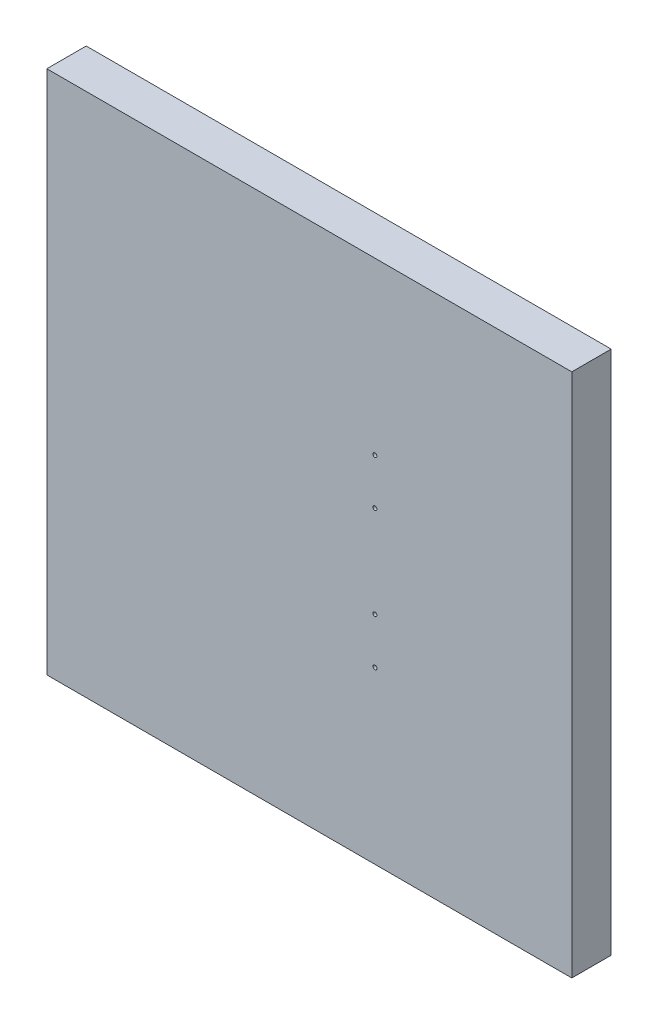
ISO-10303-21;
HEADER;
FILE_DESCRIPTION(('STEP AP214'),'2;1');
FILE_NAME('part.step','',(''),(''),'','','');
FILE_SCHEMA(('AUTOMOTIVE_DESIGN { 1 0 10303 214 1 1 1 1 }'));
ENDSEC;
DATA;
#1=APPLICATION_CONTEXT('core data for automotive mechanical design processes');
#2=APPLICATION_PROTOCOL_DEFINITION('international standard','automotive_design',2000,#1);
#3=PRODUCT_CONTEXT('',#1,'mechanical');
#4=PRODUCT('Part','Part','',(#3));
#5=PRODUCT_RELATED_PRODUCT_CATEGORY('part','',(#4));
#6=PRODUCT_DEFINITION_FORMATION('','',#4);
#7=PRODUCT_DEFINITION_CONTEXT('part definition',#1,'design');
#8=PRODUCT_DEFINITION('design','',#6,#7);
#9=PRODUCT_DEFINITION_SHAPE('','',#8);
#10=(LENGTH_UNIT() NAMED_UNIT(*) SI_UNIT(.MILLI.,.METRE.));
#11=(NAMED_UNIT(*) PLANE_ANGLE_UNIT() SI_UNIT($,.RADIAN.));
#12=(NAMED_UNIT(*) SI_UNIT($,.STERADIAN.) SOLID_ANGLE_UNIT());
#13=UNCERTAINTY_MEASURE_WITH_UNIT(LENGTH_MEASURE(1.E-05),#10,'distance_accuracy_value','');
#14=(GEOMETRIC_REPRESENTATION_CONTEXT(3) GLOBAL_UNCERTAINTY_ASSIGNED_CONTEXT((#13)) GLOBAL_UNIT_ASSIGNED_CONTEXT((#10,
#11,#12)) REPRESENTATION_CONTEXT('',''));
#15=CARTESIAN_POINT('',(0.,0.,0.));
#16=DIRECTION('',(0.,0.,1.));
#17=DIRECTION('',(1.,0.,0.));
#18=AXIS2_PLACEMENT_3D('',#15,#16,#17);
#19=CARTESIAN_POINT('',(200.,-200.,30.));
#20=DIRECTION('',(-1.,0.,0.));
#21=DIRECTION('',(0.,0.,1.));
#22=AXIS2_PLACEMENT_3D('',#19,#20,#21);
#23=PLANE('',#22);
#24=DIRECTION('',(0.,1.,0.));
#25=VECTOR('',#24,1.);
#26=CARTESIAN_POINT('',(200.,-200.,0.));
#27=LINE('',#26,#25);
#28=CARTESIAN_POINT('',(200.,-200.,0.));
#29=VERTEX_POINT('',#28);
#30=CARTESIAN_POINT('',(200.,200.,0.));
#31=VERTEX_POINT('',#30);
#32=EDGE_CURVE('E94',#29,#31,#27,.T.);
#33=ORIENTED_EDGE('',*,*,#32,.T.);
#34=DIRECTION('',(0.,0.,-1.));
#35=VECTOR('',#34,1.);
#36=CARTESIAN_POINT('',(200.,200.,30.));
#37=LINE('',#36,#35);
#38=CARTESIAN_POINT('',(200.,200.,30.));
#39=VERTEX_POINT('',#38);
#40=EDGE_CURVE('E11',#39,#31,#37,.T.);
#41=ORIENTED_EDGE('',*,*,#40,.F.);
#42=DIRECTION('',(0.,1.,0.));
#43=VECTOR('',#42,1.);
#44=CARTESIAN_POINT('',(200.,-200.,30.));
#45=LINE('',#44,#43);
#46=CARTESIAN_POINT('',(200.,-200.,30.));
#47=VERTEX_POINT('',#46);
#48=EDGE_CURVE('E82',#47,#39,#45,.T.);
#49=ORIENTED_EDGE('',*,*,#48,.F.);
#50=DIRECTION('',(0.,0.,-1.));
#51=VECTOR('',#50,1.);
#52=CARTESIAN_POINT('',(200.,-200.,30.));
#53=LINE('',#52,#51);
#54=EDGE_CURVE('E90',#47,#29,#53,.T.);
#55=ORIENTED_EDGE('',*,*,#54,.T.);
#56=EDGE_LOOP('',(#33,#41,#49,#55));
#57=FACE_BOUND('',#56,.T.);
#58=ADVANCED_FACE('F31',(#57),#23,.F.);
#59=CARTESIAN_POINT('',(-200.,200.,30.));
#60=DIRECTION('',(0.,-1.,0.));
#61=DIRECTION('',(0.,0.,-1.));
#62=AXIS2_PLACEMENT_3D('',#59,#60,#61);
#63=PLANE('',#62);
#64=DIRECTION('',(-1.,0.,0.));
#65=VECTOR('',#64,1.);
#66=CARTESIAN_POINT('',(-200.,200.,0.));
#67=LINE('',#66,#65);
#68=CARTESIAN_POINT('',(-200.,200.,0.));
#69=VERTEX_POINT('',#68);
#70=EDGE_CURVE('E86',#31,#69,#67,.T.);
#71=ORIENTED_EDGE('',*,*,#70,.T.);
#72=DIRECTION('',(0.,0.,-1.));
#73=VECTOR('',#72,1.);
#74=CARTESIAN_POINT('',(-200.,200.,30.));
#75=LINE('',#74,#73);
#76=CARTESIAN_POINT('',(-200.,200.,30.));
#77=VERTEX_POINT('',#76);
#78=EDGE_CURVE('E39',#77,#69,#75,.T.);
#79=ORIENTED_EDGE('',*,*,#78,.F.);
#80=DIRECTION('',(-1.,0.,0.));
#81=VECTOR('',#80,1.);
#82=CARTESIAN_POINT('',(-200.,200.,30.));
#83=LINE('',#82,#81);
#84=EDGE_CURVE('E77',#39,#77,#83,.T.);
#85=ORIENTED_EDGE('',*,*,#84,.F.);
#86=ORIENTED_EDGE('',*,*,#40,.T.);
#87=EDGE_LOOP('',(#71,#79,#85,#86));
#88=FACE_BOUND('',#87,.T.);
#89=ADVANCED_FACE('F85',(#88),#63,.F.);
#90=CARTESIAN_POINT('',(-200.,-200.,30.));
#91=DIRECTION('',(1.,0.,0.));
#92=DIRECTION('',(0.,0.,-1.));
#93=AXIS2_PLACEMENT_3D('',#90,#91,#92);
#94=PLANE('',#93);
#95=DIRECTION('',(0.,-1.,0.));
#96=VECTOR('',#95,1.);
#97=CARTESIAN_POINT('',(-200.,-200.,0.));
#98=LINE('',#97,#96);
#99=CARTESIAN_POINT('',(-200.,-200.,0.));
#100=VERTEX_POINT('',#99);
#101=EDGE_CURVE('E64',#69,#100,#98,.T.);
#102=ORIENTED_EDGE('',*,*,#101,.T.);
#103=DIRECTION('',(0.,0.,-1.));
#104=VECTOR('',#103,1.);
#105=CARTESIAN_POINT('',(-200.,-200.,30.));
#106=LINE('',#105,#104);
#107=CARTESIAN_POINT('',(-200.,-200.,30.));
#108=VERTEX_POINT('',#107);
#109=EDGE_CURVE('E87',#108,#100,#106,.T.);
#110=ORIENTED_EDGE('',*,*,#109,.F.);
#111=DIRECTION('',(0.,-1.,0.));
#112=VECTOR('',#111,1.);
#113=CARTESIAN_POINT('',(-200.,-200.,30.));
#114=LINE('',#113,#112);
#115=EDGE_CURVE('E80',#77,#108,#114,.T.);
#116=ORIENTED_EDGE('',*,*,#115,.F.);
#117=ORIENTED_EDGE('',*,*,#78,.T.);
#118=EDGE_LOOP('',(#102,#110,#116,#117));
#119=FACE_BOUND('',#118,.T.);
#120=ADVANCED_FACE('F88',(#119),#94,.F.);
#121=CARTESIAN_POINT('',(-200.,-200.,30.));
#122=DIRECTION('',(0.,1.,0.));
#123=DIRECTION('',(0.,0.,1.));
#124=AXIS2_PLACEMENT_3D('',#121,#122,#123);
#125=PLANE('',#124);
#126=DIRECTION('',(1.,0.,0.));
#127=VECTOR('',#126,1.);
#128=CARTESIAN_POINT('',(-200.,-200.,0.));
#129=LINE('',#128,#127);
#130=EDGE_CURVE('E70',#100,#29,#129,.T.);
#131=ORIENTED_EDGE('',*,*,#130,.T.);
#132=ORIENTED_EDGE('',*,*,#54,.F.);
#133=DIRECTION('',(1.,0.,0.));
#134=VECTOR('',#133,1.);
#135=CARTESIAN_POINT('',(-200.,-200.,30.));
#136=LINE('',#135,#134);
#137=EDGE_CURVE('E47',#108,#47,#136,.T.);
#138=ORIENTED_EDGE('',*,*,#137,.F.);
#139=ORIENTED_EDGE('',*,*,#109,.T.);
#140=EDGE_LOOP('',(#131,#132,#138,#139));
#141=FACE_BOUND('',#140,.T.);
#142=ADVANCED_FACE('F102',(#141),#125,.F.);
#143=CARTESIAN_POINT('',(200.,200.,30.));
#144=DIRECTION('',(0.,0.,-1.));
#145=DIRECTION('',(-1.,0.,0.));
#146=AXIS2_PLACEMENT_3D('',#143,#144,#145);
#147=PLANE('',#146);
#148=CARTESIAN_POINT('',(50.,-70.,30.));
#149=DIRECTION('',(0.,0.,1.));
#150=DIRECTION('',(1.,0.,0.));
#151=AXIS2_PLACEMENT_3D('',#148,#149,#150);
#152=CIRCLE('',#151,1.49999999999999);
#153=CARTESIAN_POINT('',(51.5,-70.,30.));
#154=VERTEX_POINT('',#153);
#155=EDGE_CURVE('E128',#154,#154,#152,.T.);
#156=ORIENTED_EDGE('',*,*,#155,.F.);
#157=EDGE_LOOP('',(#156));
#158=FACE_BOUND('',#157,.T.);
#159=CARTESIAN_POINT('',(50.,-35.,30.));
#160=DIRECTION('',(0.,0.,1.));
#161=DIRECTION('',(1.,0.,0.));
#162=AXIS2_PLACEMENT_3D('',#159,#160,#161);
#163=CIRCLE('',#162,1.49999999999999);
#164=CARTESIAN_POINT('',(51.5,-35.,30.));
#165=VERTEX_POINT('',#164);
#166=EDGE_CURVE('E122',#165,#165,#163,.T.);
#167=ORIENTED_EDGE('',*,*,#166,.F.);
#168=EDGE_LOOP('',(#167));
#169=FACE_BOUND('',#168,.T.);
#170=CARTESIAN_POINT('',(50.,35.,30.));
#171=DIRECTION('',(0.,0.,1.));
#172=DIRECTION('',(1.,0.,0.));
#173=AXIS2_PLACEMENT_3D('',#170,#171,#172);
#174=CIRCLE('',#173,1.49999999999999);
#175=CARTESIAN_POINT('',(51.5,35.,30.));
#176=VERTEX_POINT('',#175);
#177=EDGE_CURVE('E116',#176,#176,#174,.T.);
#178=ORIENTED_EDGE('',*,*,#177,.F.);
#179=EDGE_LOOP('',(#178));
#180=FACE_BOUND('',#179,.T.);
#181=CARTESIAN_POINT('',(50.,70.,30.));
#182=DIRECTION('',(0.,0.,1.));
#183=DIRECTION('',(1.,0.,0.));
#184=AXIS2_PLACEMENT_3D('',#181,#182,#183);
#185=CIRCLE('',#184,1.49999999999999);
#186=CARTESIAN_POINT('',(51.5,70.,30.));
#187=VERTEX_POINT('',#186);
#188=EDGE_CURVE('E110',#187,#187,#185,.T.);
#189=ORIENTED_EDGE('',*,*,#188,.F.);
#190=EDGE_LOOP('',(#189));
#191=FACE_BOUND('',#190,.T.);
#192=ORIENTED_EDGE('',*,*,#48,.T.);
#193=ORIENTED_EDGE('',*,*,#84,.T.);
#194=ORIENTED_EDGE('',*,*,#115,.T.);
#195=ORIENTED_EDGE('',*,*,#137,.T.);
#196=EDGE_LOOP('',(#192,#193,#194,#195));
#197=FACE_BOUND('',#196,.T.);
#198=ADVANCED_FACE('F78',(#158,#169,#180,#191,#197),#147,.F.);
#199=CARTESIAN_POINT('',(200.,200.,0.));
#200=DIRECTION('',(0.,0.,-1.));
#201=DIRECTION('',(-1.,0.,0.));
#202=AXIS2_PLACEMENT_3D('',#199,#200,#201);
#203=PLANE('',#202);
#204=CARTESIAN_POINT('',(50.,-70.,0.));
#205=DIRECTION('',(0.,0.,1.));
#206=DIRECTION('',(1.,0.,0.));
#207=AXIS2_PLACEMENT_3D('',#204,#205,#206);
#208=CIRCLE('',#207,1.49999999999999);
#209=CARTESIAN_POINT('',(51.5,-70.,0.));
#210=VERTEX_POINT('',#209);
#211=EDGE_CURVE('E125',#210,#210,#208,.T.);
#212=ORIENTED_EDGE('',*,*,#211,.T.);
#213=EDGE_LOOP('',(#212));
#214=FACE_BOUND('',#213,.T.);
#215=CARTESIAN_POINT('',(50.,-35.,0.));
#216=DIRECTION('',(0.,0.,1.));
#217=DIRECTION('',(1.,0.,0.));
#218=AXIS2_PLACEMENT_3D('',#215,#216,#217);
#219=CIRCLE('',#218,1.49999999999999);
#220=CARTESIAN_POINT('',(51.5,-35.,0.));
#221=VERTEX_POINT('',#220);
#222=EDGE_CURVE('E119',#221,#221,#219,.T.);
#223=ORIENTED_EDGE('',*,*,#222,.T.);
#224=EDGE_LOOP('',(#223));
#225=FACE_BOUND('',#224,.T.);
#226=CARTESIAN_POINT('',(50.,35.,0.));
#227=DIRECTION('',(0.,0.,1.));
#228=DIRECTION('',(1.,0.,0.));
#229=AXIS2_PLACEMENT_3D('',#226,#227,#228);
#230=CIRCLE('',#229,1.49999999999999);
#231=CARTESIAN_POINT('',(51.5,35.,0.));
#232=VERTEX_POINT('',#231);
#233=EDGE_CURVE('E113',#232,#232,#230,.T.);
#234=ORIENTED_EDGE('',*,*,#233,.T.);
#235=EDGE_LOOP('',(#234));
#236=FACE_BOUND('',#235,.T.);
#237=CARTESIAN_POINT('',(50.,70.,0.));
#238=DIRECTION('',(0.,0.,1.));
#239=DIRECTION('',(1.,0.,0.));
#240=AXIS2_PLACEMENT_3D('',#237,#238,#239);
#241=CIRCLE('',#240,1.49999999999999);
#242=CARTESIAN_POINT('',(51.5,70.,0.));
#243=VERTEX_POINT('',#242);
#244=EDGE_CURVE('E97',#243,#243,#241,.T.);
#245=ORIENTED_EDGE('',*,*,#244,.T.);
#246=EDGE_LOOP('',(#245));
#247=FACE_BOUND('',#246,.T.);
#248=ORIENTED_EDGE('',*,*,#32,.F.);
#249=ORIENTED_EDGE('',*,*,#130,.F.);
#250=ORIENTED_EDGE('',*,*,#101,.F.);
#251=ORIENTED_EDGE('',*,*,#70,.F.);
#252=EDGE_LOOP('',(#248,#249,#250,#251));
#253=FACE_BOUND('',#252,.T.);
#254=ADVANCED_FACE('F105',(#214,#225,#236,#247,#253),#203,.T.);
#255=CARTESIAN_POINT('',(50.,70.,30.));
#256=DIRECTION('',(0.,0.,1.));
#257=DIRECTION('',(1.,0.,0.));
#258=AXIS2_PLACEMENT_3D('',#255,#256,#257);
#259=CYLINDRICAL_SURFACE('',#258,1.49999999999999);
#260=ORIENTED_EDGE('',*,*,#244,.F.);
#261=EDGE_LOOP('',(#260));
#262=FACE_BOUND('',#261,.T.);
#263=ORIENTED_EDGE('',*,*,#188,.T.);
#264=EDGE_LOOP('',(#263));
#265=FACE_BOUND('',#264,.T.);
#266=ADVANCED_FACE('F143',(#262,#265),#259,.F.);
#267=CARTESIAN_POINT('',(50.,35.,30.));
#268=DIRECTION('',(0.,0.,1.));
#269=DIRECTION('',(1.,0.,0.));
#270=AXIS2_PLACEMENT_3D('',#267,#268,#269);
#271=CYLINDRICAL_SURFACE('',#270,1.49999999999999);
#272=ORIENTED_EDGE('',*,*,#233,.F.);
#273=EDGE_LOOP('',(#272));
#274=FACE_BOUND('',#273,.T.);
#275=ORIENTED_EDGE('',*,*,#177,.T.);
#276=EDGE_LOOP('',(#275));
#277=FACE_BOUND('',#276,.T.);
#278=ADVANCED_FACE('F145',(#274,#277),#271,.F.);
#279=CARTESIAN_POINT('',(50.,-35.,30.));
#280=DIRECTION('',(0.,0.,1.));
#281=DIRECTION('',(1.,0.,0.));
#282=AXIS2_PLACEMENT_3D('',#279,#280,#281);
#283=CYLINDRICAL_SURFACE('',#282,1.49999999999999);
#284=ORIENTED_EDGE('',*,*,#222,.F.);
#285=EDGE_LOOP('',(#284));
#286=FACE_BOUND('',#285,.T.);
#287=ORIENTED_EDGE('',*,*,#166,.T.);
#288=EDGE_LOOP('',(#287));
#289=FACE_BOUND('',#288,.T.);
#290=ADVANCED_FACE('F152',(#286,#289),#283,.F.);
#291=CARTESIAN_POINT('',(50.,-70.,30.));
#292=DIRECTION('',(0.,0.,1.));
#293=DIRECTION('',(1.,0.,0.));
#294=AXIS2_PLACEMENT_3D('',#291,#292,#293);
#295=CYLINDRICAL_SURFACE('',#294,1.49999999999999);
#296=ORIENTED_EDGE('',*,*,#211,.F.);
#297=EDGE_LOOP('',(#296));
#298=FACE_BOUND('',#297,.T.);
#299=ORIENTED_EDGE('',*,*,#155,.T.);
#300=EDGE_LOOP('',(#299));
#301=FACE_BOUND('',#300,.T.);
#302=ADVANCED_FACE('F132',(#298,#301),#295,.F.);
#303=CLOSED_SHELL('',(#58,#89,#120,#142,#198,#254,#266,#278,#290,#302));
#304=MANIFOLD_SOLID_BREP('B2',#303);
#305=ADVANCED_BREP_SHAPE_REPRESENTATION('',(#18,#304),#14);
#306=SHAPE_DEFINITION_REPRESENTATION(#9,#305);
ENDSEC;
END-ISO-10303-21;
